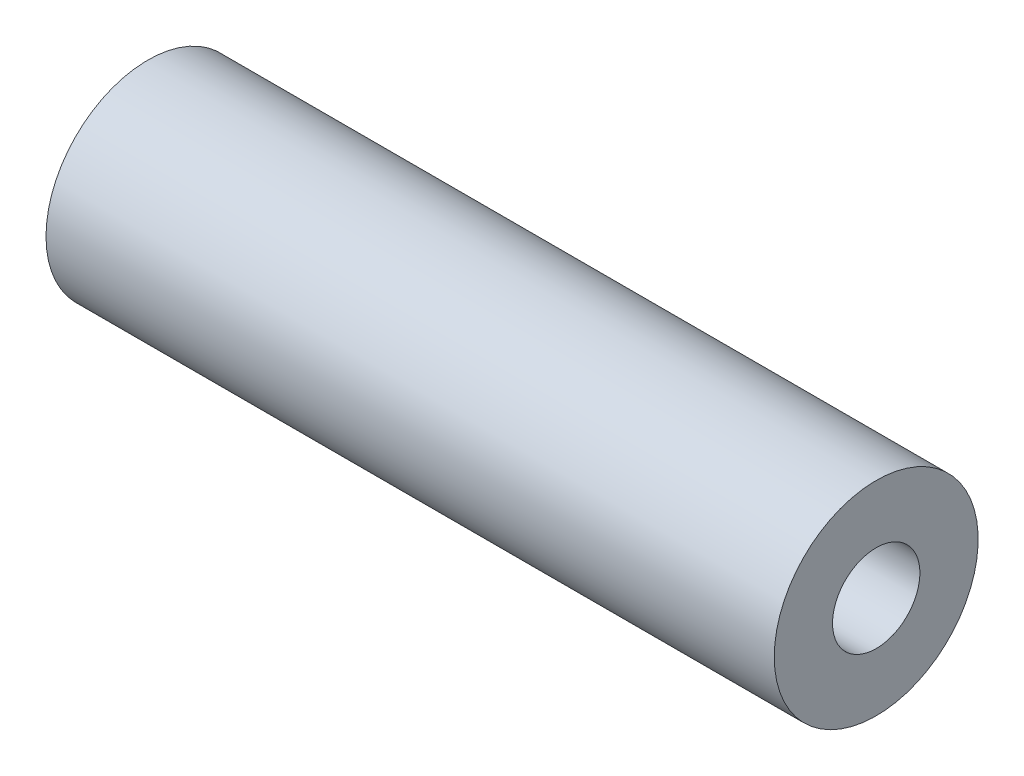
ISO-10303-21;
HEADER;
FILE_DESCRIPTION(('STEP AP214'),'2;1');
FILE_NAME('part.step','',(''),(''),'','','');
FILE_SCHEMA(('AUTOMOTIVE_DESIGN { 1 0 10303 214 1 1 1 1 }'));
ENDSEC;
DATA;
#1=APPLICATION_CONTEXT('core data for automotive mechanical design processes');
#2=APPLICATION_PROTOCOL_DEFINITION('international standard','automotive_design',2000,#1);
#3=PRODUCT_CONTEXT('',#1,'mechanical');
#4=PRODUCT('Part','Part','',(#3));
#5=PRODUCT_RELATED_PRODUCT_CATEGORY('part','',(#4));
#6=PRODUCT_DEFINITION_FORMATION('','',#4);
#7=PRODUCT_DEFINITION_CONTEXT('part definition',#1,'design');
#8=PRODUCT_DEFINITION('design','',#6,#7);
#9=PRODUCT_DEFINITION_SHAPE('','',#8);
#10=(LENGTH_UNIT() NAMED_UNIT(*) SI_UNIT(.MILLI.,.METRE.));
#11=(NAMED_UNIT(*) PLANE_ANGLE_UNIT() SI_UNIT($,.RADIAN.));
#12=(NAMED_UNIT(*) SI_UNIT($,.STERADIAN.) SOLID_ANGLE_UNIT());
#13=UNCERTAINTY_MEASURE_WITH_UNIT(LENGTH_MEASURE(1.E-05),#10,'distance_accuracy_value','');
#14=(GEOMETRIC_REPRESENTATION_CONTEXT(3) GLOBAL_UNCERTAINTY_ASSIGNED_CONTEXT((#13)) GLOBAL_UNIT_ASSIGNED_CONTEXT((#10,
#11,#12)) REPRESENTATION_CONTEXT('',''));
#15=CARTESIAN_POINT('',(0.,0.,0.));
#16=DIRECTION('',(0.,0.,1.));
#17=DIRECTION('',(1.,0.,0.));
#18=AXIS2_PLACEMENT_3D('',#15,#16,#17);
#19=CARTESIAN_POINT('',(12.5,0.,0.));
#20=DIRECTION('',(1.,0.,0.));
#21=DIRECTION('',(0.,0.,-1.));
#22=AXIS2_PLACEMENT_3D('',#19,#20,#21);
#23=PLANE('',#22);
#24=CARTESIAN_POINT('',(12.5,0.,0.));
#25=DIRECTION('',(1.,0.,0.));
#26=DIRECTION('',(0.,0.,-1.));
#27=AXIS2_PLACEMENT_3D('',#24,#25,#26);
#28=CIRCLE('',#27,3.5);
#29=CARTESIAN_POINT('',(12.5,0.,3.50000000000007));
#30=VERTEX_POINT('',#29);
#31=EDGE_CURVE('E10',#30,#30,#28,.T.);
#32=ORIENTED_EDGE('',*,*,#31,.T.);
#33=EDGE_LOOP('',(#32));
#34=FACE_BOUND('',#33,.T.);
#35=CARTESIAN_POINT('',(12.5,0.,0.));
#36=DIRECTION('',(1.,0.,0.));
#37=DIRECTION('',(0.,0.,-1.));
#38=AXIS2_PLACEMENT_3D('',#35,#36,#37);
#39=CIRCLE('',#38,1.5);
#40=CARTESIAN_POINT('',(12.5,0.,1.50000000000006));
#41=VERTEX_POINT('',#40);
#42=EDGE_CURVE('E46',#41,#41,#39,.T.);
#43=ORIENTED_EDGE('',*,*,#42,.F.);
#44=EDGE_LOOP('',(#43));
#45=FACE_BOUND('',#44,.T.);
#46=ADVANCED_FACE('F32',(#34,#45),#23,.T.);
#47=CARTESIAN_POINT('',(-12.5,0.,0.));
#48=DIRECTION('',(1.,0.,0.));
#49=DIRECTION('',(0.,0.,-1.));
#50=AXIS2_PLACEMENT_3D('',#47,#48,#49);
#51=PLANE('',#50);
#52=CARTESIAN_POINT('',(-12.5,0.,0.));
#53=DIRECTION('',(1.,0.,0.));
#54=DIRECTION('',(0.,0.,-1.));
#55=AXIS2_PLACEMENT_3D('',#52,#53,#54);
#56=CIRCLE('',#55,3.5);
#57=CARTESIAN_POINT('',(-12.5,0.,3.50000000000007));
#58=VERTEX_POINT('',#57);
#59=EDGE_CURVE('E36',#58,#58,#56,.T.);
#60=ORIENTED_EDGE('',*,*,#59,.F.);
#61=EDGE_LOOP('',(#60));
#62=FACE_BOUND('',#61,.T.);
#63=CARTESIAN_POINT('',(-12.5,0.,0.));
#64=DIRECTION('',(1.,0.,0.));
#65=DIRECTION('',(0.,0.,-1.));
#66=AXIS2_PLACEMENT_3D('',#63,#64,#65);
#67=CIRCLE('',#66,1.5);
#68=CARTESIAN_POINT('',(-12.5,0.,1.50000000000006));
#69=VERTEX_POINT('',#68);
#70=EDGE_CURVE('E48',#69,#69,#67,.T.);
#71=ORIENTED_EDGE('',*,*,#70,.T.);
#72=EDGE_LOOP('',(#71));
#73=FACE_BOUND('',#72,.T.);
#74=ADVANCED_FACE('F61',(#62,#73),#51,.F.);
#75=CARTESIAN_POINT('',(12.5,0.,0.));
#76=DIRECTION('',(-1.,0.,0.));
#77=DIRECTION('',(0.,0.,1.));
#78=AXIS2_PLACEMENT_3D('',#75,#76,#77);
#79=CYLINDRICAL_SURFACE('',#78,3.5);
#80=CARTESIAN_POINT('',(12.5,0.,3.50000000000007));
#81=CARTESIAN_POINT('',(12.2395833333333,0.,3.50000000000007));
#82=CARTESIAN_POINT('',(11.9791666666667,0.,3.50000000000007));
#83=CARTESIAN_POINT('',(11.4583333333333,0.,3.50000000000007));
#84=CARTESIAN_POINT('',(11.1979166666667,0.,3.50000000000007));
#85=CARTESIAN_POINT('',(10.6770833333333,0.,3.50000000000007));
#86=CARTESIAN_POINT('',(10.4166666666667,0.,3.50000000000007));
#87=CARTESIAN_POINT('',(9.89583333333332,0.,3.50000000000007));
#88=CARTESIAN_POINT('',(9.63541666666665,0.,3.50000000000007));
#89=CARTESIAN_POINT('',(9.11458333333332,0.,3.50000000000007));
#90=CARTESIAN_POINT('',(8.85416666666665,0.,3.50000000000007));
#91=CARTESIAN_POINT('',(8.33333333333332,0.,3.50000000000007));
#92=CARTESIAN_POINT('',(8.07291666666665,0.,3.50000000000007));
#93=CARTESIAN_POINT('',(7.55208333333332,0.,3.50000000000007));
#94=CARTESIAN_POINT('',(7.29166666666665,0.,3.50000000000007));
#95=CARTESIAN_POINT('',(6.77083333333332,0.,3.50000000000007));
#96=CARTESIAN_POINT('',(6.51041666666665,0.,3.50000000000007));
#97=CARTESIAN_POINT('',(5.98958333333332,0.,3.50000000000007));
#98=CARTESIAN_POINT('',(5.72916666666665,0.,3.50000000000007));
#99=CARTESIAN_POINT('',(5.20833333333332,0.,3.50000000000007));
#100=CARTESIAN_POINT('',(4.94791666666665,0.,3.50000000000007));
#101=CARTESIAN_POINT('',(4.42708333333332,0.,3.50000000000007));
#102=CARTESIAN_POINT('',(4.16666666666665,0.,3.50000000000007));
#103=CARTESIAN_POINT('',(3.64583333333332,0.,3.50000000000007));
#104=CARTESIAN_POINT('',(3.38541666666665,0.,3.50000000000007));
#105=CARTESIAN_POINT('',(2.86458333333332,0.,3.50000000000007));
#106=CARTESIAN_POINT('',(2.60416666666665,0.,3.50000000000007));
#107=CARTESIAN_POINT('',(2.08333333333332,0.,3.50000000000007));
#108=CARTESIAN_POINT('',(1.82291666666665,0.,3.50000000000007));
#109=CARTESIAN_POINT('',(1.30208333333332,0.,3.50000000000007));
#110=CARTESIAN_POINT('',(1.04166666666665,0.,3.50000000000007));
#111=CARTESIAN_POINT('',(0.52083333333332,0.,3.50000000000007));
#112=CARTESIAN_POINT('',(0.260416666666654,0.,3.50000000000007));
#113=CARTESIAN_POINT('',(-0.260416666666679,0.,3.50000000000007));
#114=CARTESIAN_POINT('',(-0.520833333333346,0.,3.50000000000007));
#115=CARTESIAN_POINT('',(-1.04166666666668,0.,3.50000000000007));
#116=CARTESIAN_POINT('',(-1.30208333333335,0.,3.50000000000007));
#117=CARTESIAN_POINT('',(-1.82291666666668,0.,3.50000000000007));
#118=CARTESIAN_POINT('',(-2.08333333333335,0.,3.50000000000007));
#119=CARTESIAN_POINT('',(-2.60416666666668,0.,3.50000000000007));
#120=CARTESIAN_POINT('',(-2.86458333333335,0.,3.50000000000007));
#121=CARTESIAN_POINT('',(-3.38541666666668,0.,3.50000000000007));
#122=CARTESIAN_POINT('',(-3.64583333333335,0.,3.50000000000007));
#123=CARTESIAN_POINT('',(-4.16666666666668,0.,3.50000000000007));
#124=CARTESIAN_POINT('',(-4.42708333333335,0.,3.50000000000007));
#125=CARTESIAN_POINT('',(-4.94791666666668,0.,3.50000000000007));
#126=CARTESIAN_POINT('',(-5.20833333333335,0.,3.50000000000007));
#127=CARTESIAN_POINT('',(-5.72916666666668,0.,3.50000000000007));
#128=CARTESIAN_POINT('',(-5.98958333333335,0.,3.50000000000007));
#129=CARTESIAN_POINT('',(-6.51041666666668,0.,3.50000000000007));
#130=CARTESIAN_POINT('',(-6.77083333333335,0.,3.50000000000007));
#131=CARTESIAN_POINT('',(-7.29166666666668,0.,3.50000000000007));
#132=CARTESIAN_POINT('',(-7.55208333333335,0.,3.50000000000007));
#133=CARTESIAN_POINT('',(-8.07291666666668,0.,3.50000000000007));
#134=CARTESIAN_POINT('',(-8.33333333333335,0.,3.50000000000007));
#135=CARTESIAN_POINT('',(-8.85416666666668,0.,3.50000000000007));
#136=CARTESIAN_POINT('',(-9.11458333333335,0.,3.50000000000007));
#137=CARTESIAN_POINT('',(-9.63541666666668,0.,3.50000000000007));
#138=CARTESIAN_POINT('',(-9.89583333333335,0.,3.50000000000007));
#139=CARTESIAN_POINT('',(-10.4166666666667,0.,3.50000000000007));
#140=CARTESIAN_POINT('',(-10.6770833333333,0.,3.50000000000007));
#141=CARTESIAN_POINT('',(-11.1979166666667,0.,3.50000000000007));
#142=CARTESIAN_POINT('',(-11.4583333333333,0.,3.50000000000007));
#143=CARTESIAN_POINT('',(-11.9791666666667,0.,3.50000000000007));
#144=CARTESIAN_POINT('',(-12.2395833333333,0.,3.50000000000007));
#145=CARTESIAN_POINT('',(-12.5,0.,3.50000000000007));
#146=B_SPLINE_CURVE_WITH_KNOTS('',3,(#80,#81,#82,#83,#84,#85,#86,#87,#88,#89,#90,#91,#92,#93,
#94,#95,#96,#97,#98,#99,#100,#101,#102,#103,#104,#105,#106,#107,#108,#109,#110,#111,#112,#113,
#114,#115,#116,#117,#118,#119,#120,#121,#122,#123,#124,#125,#126,#127,#128,#129,#130,#131,#132,
#133,#134,#135,#136,#137,#138,#139,#140,#141,#142,#143,#144,#145),.UNSPECIFIED.,.F.,.F.,(4,2,2,
2,2,2,2,2,2,2,2,2,2,2,2,2,2,2,2,2,2,2,2,2,2,2,2,2,2,2,2,2,4),(0.,0.781250000000001,1.5625,
2.34375,3.125,3.90625,4.6875,5.46875,6.25,7.03125,7.8125,8.59375,9.375,10.15625,10.9375,
11.71875,12.5,13.28125,14.0625,14.84375,15.625,16.40625,17.1875,17.96875,18.75,19.53125,20.3125,
21.09375,21.875,22.65625,23.4375,24.21875,25.),.UNSPECIFIED.);
#147=EDGE_CURVE('BSEAM34',#30,#58,#146,.T.);
#148=ORIENTED_EDGE('',*,*,#31,.F.);
#149=ORIENTED_EDGE('',*,*,#59,.T.);
#150=ORIENTED_EDGE('',*,*,#147,.T.);
#151=ORIENTED_EDGE('',*,*,#147,.F.);
#152=EDGE_LOOP('',(#148,#150,#149,#151));
#153=FACE_BOUND('',#152,.T.);
#154=ADVANCED_FACE('F34',(#153),#79,.T.);
#155=CARTESIAN_POINT('',(12.5,0.,0.));
#156=DIRECTION('',(-1.,0.,0.));
#157=DIRECTION('',(0.,0.,1.));
#158=AXIS2_PLACEMENT_3D('',#155,#156,#157);
#159=CYLINDRICAL_SURFACE('',#158,1.5);
#160=CARTESIAN_POINT('',(12.5,0.,1.50000000000006));
#161=CARTESIAN_POINT('',(12.2395833333333,0.,1.50000000000006));
#162=CARTESIAN_POINT('',(11.9791666666667,0.,1.50000000000006));
#163=CARTESIAN_POINT('',(11.4583333333333,0.,1.50000000000006));
#164=CARTESIAN_POINT('',(11.1979166666667,0.,1.50000000000006));
#165=CARTESIAN_POINT('',(10.6770833333333,0.,1.50000000000006));
#166=CARTESIAN_POINT('',(10.4166666666667,0.,1.50000000000006));
#167=CARTESIAN_POINT('',(9.89583333333332,0.,1.50000000000006));
#168=CARTESIAN_POINT('',(9.63541666666665,0.,1.50000000000006));
#169=CARTESIAN_POINT('',(9.11458333333332,0.,1.50000000000006));
#170=CARTESIAN_POINT('',(8.85416666666665,0.,1.50000000000006));
#171=CARTESIAN_POINT('',(8.33333333333332,0.,1.50000000000006));
#172=CARTESIAN_POINT('',(8.07291666666665,0.,1.50000000000006));
#173=CARTESIAN_POINT('',(7.55208333333332,0.,1.50000000000006));
#174=CARTESIAN_POINT('',(7.29166666666665,0.,1.50000000000006));
#175=CARTESIAN_POINT('',(6.77083333333332,0.,1.50000000000006));
#176=CARTESIAN_POINT('',(6.51041666666665,0.,1.50000000000006));
#177=CARTESIAN_POINT('',(5.98958333333332,0.,1.50000000000006));
#178=CARTESIAN_POINT('',(5.72916666666665,0.,1.50000000000006));
#179=CARTESIAN_POINT('',(5.20833333333332,0.,1.50000000000006));
#180=CARTESIAN_POINT('',(4.94791666666665,0.,1.50000000000006));
#181=CARTESIAN_POINT('',(4.42708333333332,0.,1.50000000000006));
#182=CARTESIAN_POINT('',(4.16666666666665,0.,1.50000000000006));
#183=CARTESIAN_POINT('',(3.64583333333332,0.,1.50000000000006));
#184=CARTESIAN_POINT('',(3.38541666666665,0.,1.50000000000006));
#185=CARTESIAN_POINT('',(2.86458333333332,0.,1.50000000000006));
#186=CARTESIAN_POINT('',(2.60416666666665,0.,1.50000000000006));
#187=CARTESIAN_POINT('',(2.08333333333332,0.,1.50000000000006));
#188=CARTESIAN_POINT('',(1.82291666666665,0.,1.50000000000006));
#189=CARTESIAN_POINT('',(1.30208333333332,0.,1.50000000000006));
#190=CARTESIAN_POINT('',(1.04166666666665,0.,1.50000000000006));
#191=CARTESIAN_POINT('',(0.52083333333332,0.,1.50000000000006));
#192=CARTESIAN_POINT('',(0.260416666666653,0.,1.50000000000006));
#193=CARTESIAN_POINT('',(-0.260416666666681,0.,1.50000000000006));
#194=CARTESIAN_POINT('',(-0.520833333333348,0.,1.50000000000006));
#195=CARTESIAN_POINT('',(-1.04166666666668,0.,1.50000000000006));
#196=CARTESIAN_POINT('',(-1.30208333333335,0.,1.50000000000006));
#197=CARTESIAN_POINT('',(-1.82291666666668,0.,1.50000000000006));
#198=CARTESIAN_POINT('',(-2.08333333333335,0.,1.50000000000006));
#199=CARTESIAN_POINT('',(-2.60416666666668,0.,1.50000000000006));
#200=CARTESIAN_POINT('',(-2.86458333333335,0.,1.50000000000006));
#201=CARTESIAN_POINT('',(-3.38541666666668,0.,1.50000000000006));
#202=CARTESIAN_POINT('',(-3.64583333333335,0.,1.50000000000006));
#203=CARTESIAN_POINT('',(-4.16666666666668,0.,1.50000000000006));
#204=CARTESIAN_POINT('',(-4.42708333333335,0.,1.50000000000006));
#205=CARTESIAN_POINT('',(-4.94791666666668,0.,1.50000000000006));
#206=CARTESIAN_POINT('',(-5.20833333333335,0.,1.50000000000006));
#207=CARTESIAN_POINT('',(-5.72916666666668,0.,1.50000000000006));
#208=CARTESIAN_POINT('',(-5.98958333333335,0.,1.50000000000006));
#209=CARTESIAN_POINT('',(-6.51041666666668,0.,1.50000000000006));
#210=CARTESIAN_POINT('',(-6.77083333333335,0.,1.50000000000006));
#211=CARTESIAN_POINT('',(-7.29166666666668,0.,1.50000000000006));
#212=CARTESIAN_POINT('',(-7.55208333333335,0.,1.50000000000006));
#213=CARTESIAN_POINT('',(-8.07291666666668,0.,1.50000000000006));
#214=CARTESIAN_POINT('',(-8.33333333333335,0.,1.50000000000006));
#215=CARTESIAN_POINT('',(-8.85416666666668,0.,1.50000000000006));
#216=CARTESIAN_POINT('',(-9.11458333333335,0.,1.50000000000006));
#217=CARTESIAN_POINT('',(-9.63541666666668,0.,1.50000000000006));
#218=CARTESIAN_POINT('',(-9.89583333333335,0.,1.50000000000006));
#219=CARTESIAN_POINT('',(-10.4166666666667,0.,1.50000000000006));
#220=CARTESIAN_POINT('',(-10.6770833333333,0.,1.50000000000006));
#221=CARTESIAN_POINT('',(-11.1979166666667,0.,1.50000000000006));
#222=CARTESIAN_POINT('',(-11.4583333333333,0.,1.50000000000006));
#223=CARTESIAN_POINT('',(-11.9791666666667,0.,1.50000000000006));
#224=CARTESIAN_POINT('',(-12.2395833333333,0.,1.50000000000006));
#225=CARTESIAN_POINT('',(-12.5,0.,1.50000000000006));
#226=B_SPLINE_CURVE_WITH_KNOTS('',3,(#160,#161,#162,#163,#164,#165,#166,#167,#168,#169,#170,
#171,#172,#173,#174,#175,#176,#177,#178,#179,#180,#181,#182,#183,#184,#185,#186,#187,#188,#189,
#190,#191,#192,#193,#194,#195,#196,#197,#198,#199,#200,#201,#202,#203,#204,#205,#206,#207,#208,
#209,#210,#211,#212,#213,#214,#215,#216,#217,#218,#219,#220,#221,#222,#223,#224,#225),
.UNSPECIFIED.,.F.,.F.,(4,2,2,2,2,2,2,2,2,2,2,2,2,2,2,2,2,2,2,2,2,2,2,2,2,2,2,2,2,2,2,2,4),(0.,
0.781249999999999,1.5625,2.34375,3.125,3.90625,4.6875,5.46875,6.25,7.03125,7.8125,8.59375,9.375,
10.15625,10.9375,11.71875,12.5,13.28125,14.0625,14.84375,15.625,16.40625,17.1875,17.96875,18.75,
19.53125,20.3125,21.09375,21.875,22.65625,23.4375,24.21875,25.),.UNSPECIFIED.);
#227=EDGE_CURVE('BSEAM57',#41,#69,#226,.T.);
#228=ORIENTED_EDGE('',*,*,#42,.T.);
#229=ORIENTED_EDGE('',*,*,#70,.F.);
#230=ORIENTED_EDGE('',*,*,#227,.T.);
#231=ORIENTED_EDGE('',*,*,#227,.F.);
#232=EDGE_LOOP('',(#228,#230,#229,#231));
#233=FACE_BOUND('',#232,.T.);
#234=ADVANCED_FACE('F57',(#233),#159,.F.);
#235=CLOSED_SHELL('',(#46,#74,#154,#234));
#236=MANIFOLD_SOLID_BREP('B2',#235);
#237=ADVANCED_BREP_SHAPE_REPRESENTATION('',(#18,#236),#14);
#238=SHAPE_DEFINITION_REPRESENTATION(#9,#237);
ENDSEC;
END-ISO-10303-21;
